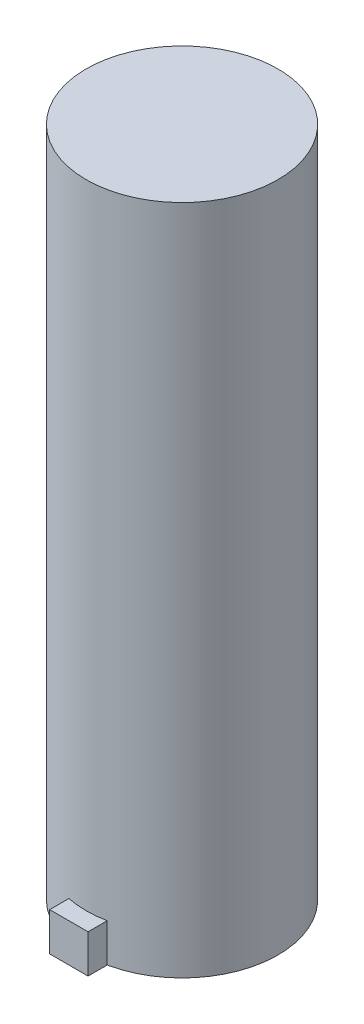
ISO-10303-21;
HEADER;
FILE_DESCRIPTION(('STEP AP214'),'2;1');
FILE_NAME('part.step','',(''),(''),'','','');
FILE_SCHEMA(('AUTOMOTIVE_DESIGN { 1 0 10303 214 1 1 1 1 }'));
ENDSEC;
DATA;
#1=APPLICATION_CONTEXT('core data for automotive mechanical design processes');
#2=APPLICATION_PROTOCOL_DEFINITION('international standard','automotive_design',2000,#1);
#3=PRODUCT_CONTEXT('',#1,'mechanical');
#4=PRODUCT('Part','Part','',(#3));
#5=PRODUCT_RELATED_PRODUCT_CATEGORY('part','',(#4));
#6=PRODUCT_DEFINITION_FORMATION('','',#4);
#7=PRODUCT_DEFINITION_CONTEXT('part definition',#1,'design');
#8=PRODUCT_DEFINITION('design','',#6,#7);
#9=PRODUCT_DEFINITION_SHAPE('','',#8);
#10=(LENGTH_UNIT() NAMED_UNIT(*) SI_UNIT(.MILLI.,.METRE.));
#11=(NAMED_UNIT(*) PLANE_ANGLE_UNIT() SI_UNIT($,.RADIAN.));
#12=(NAMED_UNIT(*) SI_UNIT($,.STERADIAN.) SOLID_ANGLE_UNIT());
#13=UNCERTAINTY_MEASURE_WITH_UNIT(LENGTH_MEASURE(1.E-05),#10,'distance_accuracy_value','');
#14=(GEOMETRIC_REPRESENTATION_CONTEXT(3) GLOBAL_UNCERTAINTY_ASSIGNED_CONTEXT((#13)) GLOBAL_UNIT_ASSIGNED_CONTEXT((#10,
#11,#12)) REPRESENTATION_CONTEXT('',''));
#15=CARTESIAN_POINT('',(0.,0.,0.));
#16=DIRECTION('',(0.,0.,1.));
#17=DIRECTION('',(1.,0.,0.));
#18=AXIS2_PLACEMENT_3D('',#15,#16,#17);
#19=CARTESIAN_POINT('',(-2.,4.,11.7979589711327));
#20=DIRECTION('',(0.,0.,1.));
#21=DIRECTION('',(1.,0.,0.));
#22=AXIS2_PLACEMENT_3D('',#19,#20,#21);
#23=PLANE('',#22);
#24=DIRECTION('',(-1.,0.,0.));
#25=VECTOR('',#24,1.);
#26=CARTESIAN_POINT('',(-2.,0.,11.7979589711327));
#27=LINE('',#26,#25);
#28=CARTESIAN_POINT('',(2.,0.,11.7979589711327));
#29=VERTEX_POINT('',#28);
#30=CARTESIAN_POINT('',(-2.,0.,11.7979589711327));
#31=VERTEX_POINT('',#30);
#32=EDGE_CURVE('E105',#29,#31,#27,.T.);
#33=ORIENTED_EDGE('',*,*,#32,.F.);
#34=DIRECTION('',(0.,-1.,0.));
#35=VECTOR('',#34,1.);
#36=CARTESIAN_POINT('',(2.,4.,11.7979589711327));
#37=LINE('',#36,#35);
#38=CARTESIAN_POINT('',(2.,4.,11.7979589711327));
#39=VERTEX_POINT('',#38);
#40=EDGE_CURVE('E12',#39,#29,#37,.T.);
#41=ORIENTED_EDGE('',*,*,#40,.F.);
#42=DIRECTION('',(-1.,0.,0.));
#43=VECTOR('',#42,1.);
#44=CARTESIAN_POINT('',(-2.,4.,11.7979589711327));
#45=LINE('',#44,#43);
#46=CARTESIAN_POINT('',(-2.,4.,11.7979589711327));
#47=VERTEX_POINT('',#46);
#48=EDGE_CURVE('E99',#39,#47,#45,.T.);
#49=ORIENTED_EDGE('',*,*,#48,.T.);
#50=DIRECTION('',(0.,-1.,0.));
#51=VECTOR('',#50,1.);
#52=CARTESIAN_POINT('',(-2.,4.,11.7979589711327));
#53=LINE('',#52,#51);
#54=EDGE_CURVE('E44',#47,#31,#53,.T.);
#55=ORIENTED_EDGE('',*,*,#54,.T.);
#56=EDGE_LOOP('',(#33,#41,#49,#55));
#57=FACE_BOUND('',#56,.T.);
#58=ADVANCED_FACE('F41',(#57),#23,.T.);
#59=CARTESIAN_POINT('',(2.,4.,11.7979589711327));
#60=DIRECTION('',(1.,0.,0.));
#61=DIRECTION('',(0.,0.,-1.));
#62=AXIS2_PLACEMENT_3D('',#59,#60,#61);
#63=PLANE('',#62);
#64=DIRECTION('',(0.,0.,1.));
#65=VECTOR('',#64,1.);
#66=CARTESIAN_POINT('',(2.,0.,11.7979589711327));
#67=LINE('',#66,#65);
#68=CARTESIAN_POINT('',(2.,0.,9.79795897113272));
#69=VERTEX_POINT('',#68);
#70=EDGE_CURVE('E101',#69,#29,#67,.T.);
#71=ORIENTED_EDGE('',*,*,#70,.F.);
#72=DIRECTION('',(0.,-1.,0.));
#73=VECTOR('',#72,1.);
#74=CARTESIAN_POINT('',(2.,4.,9.79795897113272));
#75=LINE('',#74,#73);
#76=CARTESIAN_POINT('',(2.,4.,9.79795897113272));
#77=VERTEX_POINT('',#76);
#78=EDGE_CURVE('E50',#77,#69,#75,.T.);
#79=ORIENTED_EDGE('',*,*,#78,.F.);
#80=DIRECTION('',(0.,0.,1.));
#81=VECTOR('',#80,1.);
#82=CARTESIAN_POINT('',(2.,4.,11.7979589711327));
#83=LINE('',#82,#81);
#84=EDGE_CURVE('E96',#77,#39,#83,.T.);
#85=ORIENTED_EDGE('',*,*,#84,.T.);
#86=ORIENTED_EDGE('',*,*,#40,.T.);
#87=EDGE_LOOP('',(#71,#79,#85,#86));
#88=FACE_BOUND('',#87,.T.);
#89=ADVANCED_FACE('F115',(#88),#63,.T.);
#90=CARTESIAN_POINT('',(0.,4.,0.));
#91=DIRECTION('',(0.,-1.,0.));
#92=DIRECTION('',(0.,0.,-1.));
#93=AXIS2_PLACEMENT_3D('',#90,#91,#92);
#94=CYLINDRICAL_SURFACE('',#93,10.);
#95=CARTESIAN_POINT('',(0.,0.,0.));
#96=DIRECTION('',(0.,1.,0.));
#97=DIRECTION('',(0.,0.,-1.));
#98=AXIS2_PLACEMENT_3D('',#95,#96,#97);
#99=CIRCLE('',#98,10.);
#100=CARTESIAN_POINT('',(-2.,0.,9.79795897113272));
#101=VERTEX_POINT('',#100);
#102=EDGE_CURVE('E91',#101,#69,#99,.T.);
#103=ORIENTED_EDGE('',*,*,#102,.F.);
#104=DIRECTION('',(0.,-1.,0.));
#105=VECTOR('',#104,1.);
#106=CARTESIAN_POINT('',(-2.,4.,9.79795897113272));
#107=LINE('',#106,#105);
#108=CARTESIAN_POINT('',(-2.,4.,9.79795897113272));
#109=VERTEX_POINT('',#108);
#110=EDGE_CURVE('E86',#109,#101,#107,.T.);
#111=ORIENTED_EDGE('',*,*,#110,.F.);
#112=CARTESIAN_POINT('',(0.,4.,0.));
#113=DIRECTION('',(0.,1.,0.));
#114=DIRECTION('',(0.,0.,-1.));
#115=AXIS2_PLACEMENT_3D('',#112,#113,#114);
#116=CIRCLE('',#115,10.);
#117=EDGE_CURVE('E89',#109,#77,#116,.T.);
#118=ORIENTED_EDGE('',*,*,#117,.T.);
#119=ORIENTED_EDGE('',*,*,#78,.T.);
#120=EDGE_LOOP('',(#103,#111,#118,#119));
#121=FACE_BOUND('',#120,.T.);
#122=ADVANCED_FACE('F88',(#121),#94,.F.);
#123=CARTESIAN_POINT('',(-2.,4.,11.7979589711327));
#124=DIRECTION('',(-1.,0.,0.));
#125=DIRECTION('',(0.,0.,1.));
#126=AXIS2_PLACEMENT_3D('',#123,#124,#125);
#127=PLANE('',#126);
#128=DIRECTION('',(0.,0.,-1.));
#129=VECTOR('',#128,1.);
#130=CARTESIAN_POINT('',(-2.,0.,11.7979589711327));
#131=LINE('',#130,#129);
#132=EDGE_CURVE('E108',#31,#101,#131,.T.);
#133=ORIENTED_EDGE('',*,*,#132,.F.);
#134=ORIENTED_EDGE('',*,*,#54,.F.);
#135=DIRECTION('',(0.,0.,-1.));
#136=VECTOR('',#135,1.);
#137=CARTESIAN_POINT('',(-2.,4.,11.7979589711327));
#138=LINE('',#137,#136);
#139=EDGE_CURVE('E95',#47,#109,#138,.T.);
#140=ORIENTED_EDGE('',*,*,#139,.T.);
#141=ORIENTED_EDGE('',*,*,#110,.T.);
#142=EDGE_LOOP('',(#133,#134,#140,#141));
#143=FACE_BOUND('',#142,.T.);
#144=ADVANCED_FACE('F98',(#143),#127,.T.);
#145=CARTESIAN_POINT('',(0.,4.,0.));
#146=DIRECTION('',(0.,-1.,0.));
#147=DIRECTION('',(0.,0.,-1.));
#148=AXIS2_PLACEMENT_3D('',#145,#146,#147);
#149=PLANE('',#148);
#150=ORIENTED_EDGE('',*,*,#48,.F.);
#151=ORIENTED_EDGE('',*,*,#84,.F.);
#152=ORIENTED_EDGE('',*,*,#117,.F.);
#153=ORIENTED_EDGE('',*,*,#139,.F.);
#154=EDGE_LOOP('',(#150,#151,#152,#153));
#155=FACE_BOUND('',#154,.T.);
#156=ADVANCED_FACE('F94',(#155),#149,.F.);
#157=CARTESIAN_POINT('',(0.,0.,0.));
#158=DIRECTION('',(0.,-1.,0.));
#159=DIRECTION('',(0.,0.,-1.));
#160=AXIS2_PLACEMENT_3D('',#157,#158,#159);
#161=PLANE('',#160);
#162=ORIENTED_EDGE('',*,*,#32,.T.);
#163=ORIENTED_EDGE('',*,*,#132,.T.);
#164=ORIENTED_EDGE('',*,*,#102,.T.);
#165=ORIENTED_EDGE('',*,*,#70,.T.);
#166=EDGE_LOOP('',(#162,#163,#164,#165));
#167=FACE_BOUND('',#166,.T.);
#168=ADVANCED_FACE('F114',(#167),#161,.T.);
#169=CLOSED_SHELL('',(#58,#89,#122,#144,#156,#168));
#170=MANIFOLD_SOLID_BREP('B2',#169);
#171=CARTESIAN_POINT('',(0.,0.,0.));
#172=DIRECTION('',(0.,1.,0.));
#173=DIRECTION('',(0.,0.,1.));
#174=AXIS2_PLACEMENT_3D('',#171,#172,#173);
#175=PLANE('',#174);
#176=CARTESIAN_POINT('',(0.,0.,0.));
#177=DIRECTION('',(0.,1.,0.));
#178=DIRECTION('',(0.,0.,1.));
#179=AXIS2_PLACEMENT_3D('',#176,#177,#178);
#180=CIRCLE('',#179,10.);
#181=CARTESIAN_POINT('',(0.,0.,10.));
#182=VERTEX_POINT('',#181);
#183=EDGE_CURVE('E40',#182,#182,#180,.T.);
#184=ORIENTED_EDGE('',*,*,#183,.F.);
#185=EDGE_LOOP('',(#184));
#186=FACE_BOUND('',#185,.T.);
#187=ADVANCED_FACE('F165',(#186),#175,.F.);
#188=CARTESIAN_POINT('',(0.,70.,0.));
#189=DIRECTION('',(0.,1.,0.));
#190=DIRECTION('',(0.,0.,1.));
#191=AXIS2_PLACEMENT_3D('',#188,#189,#190);
#192=CYLINDRICAL_SURFACE('',#191,10.);
#193=CARTESIAN_POINT('',(0.,70.,0.));
#194=DIRECTION('',(0.,1.,0.));
#195=DIRECTION('',(0.,0.,1.));
#196=AXIS2_PLACEMENT_3D('',#193,#194,#195);
#197=CIRCLE('',#196,10.);
#198=CARTESIAN_POINT('',(0.,70.,10.));
#199=VERTEX_POINT('',#198);
#200=EDGE_CURVE('E171',#199,#199,#197,.T.);
#201=ORIENTED_EDGE('',*,*,#200,.F.);
#202=EDGE_LOOP('',(#201));
#203=FACE_BOUND('',#202,.T.);
#204=ORIENTED_EDGE('',*,*,#183,.T.);
#205=EDGE_LOOP('',(#204));
#206=FACE_BOUND('',#205,.T.);
#207=ADVANCED_FACE('F179',(#203,#206),#192,.T.);
#208=CARTESIAN_POINT('',(10.,70.,0.));
#209=DIRECTION('',(0.,-1.,0.));
#210=DIRECTION('',(0.,0.,-1.));
#211=AXIS2_PLACEMENT_3D('',#208,#209,#210);
#212=PLANE('',#211);
#213=ORIENTED_EDGE('',*,*,#200,.T.);
#214=EDGE_LOOP('',(#213));
#215=FACE_BOUND('',#214,.T.);
#216=ADVANCED_FACE('F177',(#215),#212,.F.);
#217=CLOSED_SHELL('',(#187,#207,#216));
#218=MANIFOLD_SOLID_BREP('B6',#217);
#219=ADVANCED_BREP_SHAPE_REPRESENTATION('',(#18,#170,#218),#14);
#220=SHAPE_DEFINITION_REPRESENTATION(#9,#219);
ENDSEC;
END-ISO-10303-21;
